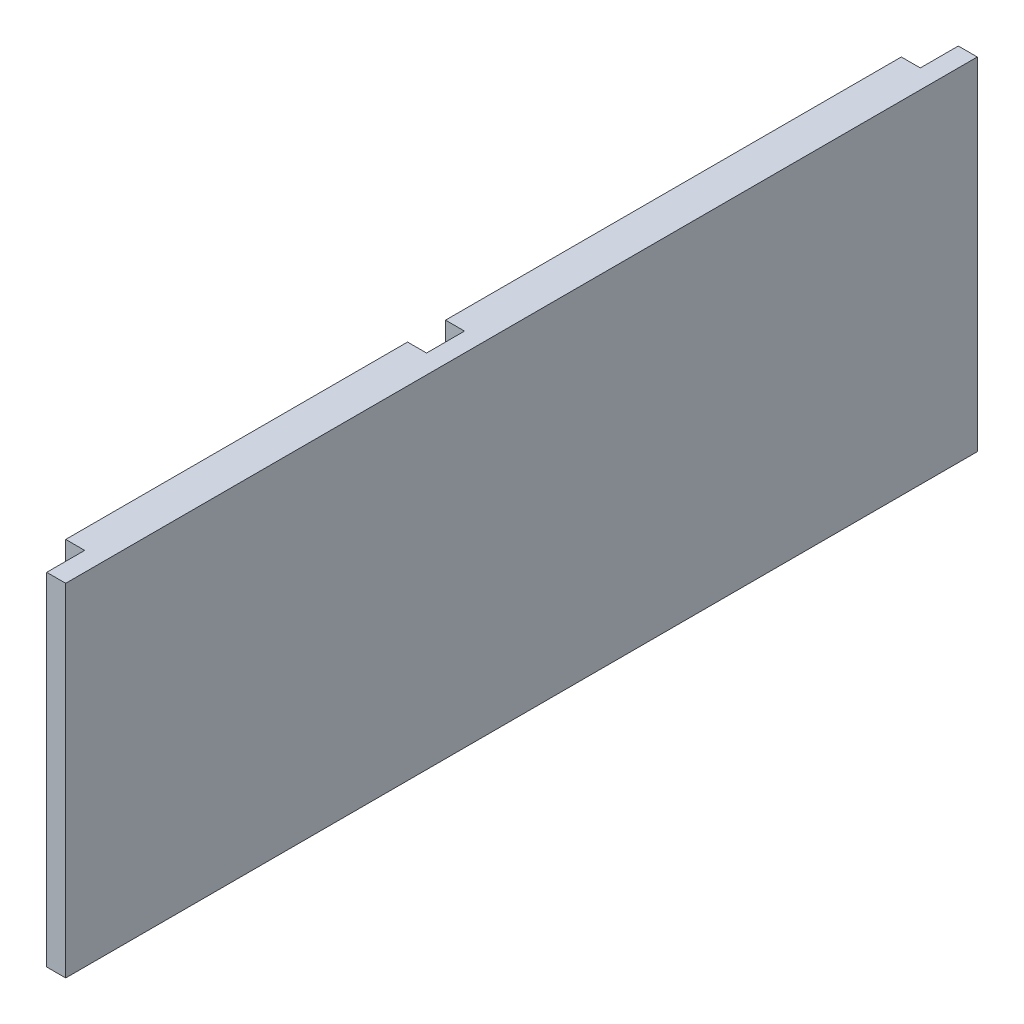
ISO-10303-21;
HEADER;
FILE_DESCRIPTION(('STEP AP214'),'2;1');
FILE_NAME('part.step','',(''),(''),'','','');
FILE_SCHEMA(('AUTOMOTIVE_DESIGN { 1 0 10303 214 1 1 1 1 }'));
ENDSEC;
DATA;
#1=APPLICATION_CONTEXT('core data for automotive mechanical design processes');
#2=APPLICATION_PROTOCOL_DEFINITION('international standard','automotive_design',2000,#1);
#3=PRODUCT_CONTEXT('',#1,'mechanical');
#4=PRODUCT('Part','Part','',(#3));
#5=PRODUCT_RELATED_PRODUCT_CATEGORY('part','',(#4));
#6=PRODUCT_DEFINITION_FORMATION('','',#4);
#7=PRODUCT_DEFINITION_CONTEXT('part definition',#1,'design');
#8=PRODUCT_DEFINITION('design','',#6,#7);
#9=PRODUCT_DEFINITION_SHAPE('','',#8);
#10=(LENGTH_UNIT() NAMED_UNIT(*) SI_UNIT(.MILLI.,.METRE.));
#11=(NAMED_UNIT(*) PLANE_ANGLE_UNIT() SI_UNIT($,.RADIAN.));
#12=(NAMED_UNIT(*) SI_UNIT($,.STERADIAN.) SOLID_ANGLE_UNIT());
#13=UNCERTAINTY_MEASURE_WITH_UNIT(LENGTH_MEASURE(1.E-05),#10,'distance_accuracy_value','');
#14=(GEOMETRIC_REPRESENTATION_CONTEXT(3) GLOBAL_UNCERTAINTY_ASSIGNED_CONTEXT((#13)) GLOBAL_UNIT_ASSIGNED_CONTEXT((#10,
#11,#12)) REPRESENTATION_CONTEXT('',''));
#15=CARTESIAN_POINT('',(0.,0.,0.));
#16=DIRECTION('',(0.,0.,1.));
#17=DIRECTION('',(1.,0.,0.));
#18=AXIS2_PLACEMENT_3D('',#15,#16,#17);
#19=CARTESIAN_POINT('',(0.,0.,0.));
#20=DIRECTION('',(-1.,0.,0.));
#21=DIRECTION('',(0.,0.,1.));
#22=AXIS2_PLACEMENT_3D('',#19,#20,#21);
#23=PLANE('',#22);
#24=DIRECTION('',(0.,-1.,0.));
#25=VECTOR('',#24,1.);
#26=CARTESIAN_POINT('',(0.,114.3,-139.7));
#27=LINE('',#26,#25);
#28=CARTESIAN_POINT('',(0.,114.3,-139.7));
#29=VERTEX_POINT('',#28);
#30=CARTESIAN_POINT('',(0.,0.,-139.7));
#31=VERTEX_POINT('',#30);
#32=EDGE_CURVE('E130',#29,#31,#27,.T.);
#33=ORIENTED_EDGE('',*,*,#32,.F.);
#34=DIRECTION('',(0.,0.,1.));
#35=VECTOR('',#34,1.);
#36=CARTESIAN_POINT('',(0.,114.3,0.));
#37=LINE('',#36,#35);
#38=CARTESIAN_POINT('',(0.,114.3,-292.1));
#39=VERTEX_POINT('',#38);
#40=EDGE_CURVE('E197',#39,#29,#37,.T.);
#41=ORIENTED_EDGE('',*,*,#40,.F.);
#42=DIRECTION('',(0.,1.,0.));
#43=VECTOR('',#42,1.);
#44=CARTESIAN_POINT('',(0.,114.3,-292.1));
#45=LINE('',#44,#43);
#46=CARTESIAN_POINT('',(0.,0.,-292.1));
#47=VERTEX_POINT('',#46);
#48=EDGE_CURVE('E154',#47,#39,#45,.T.);
#49=ORIENTED_EDGE('',*,*,#48,.F.);
#50=DIRECTION('',(0.,0.,-1.));
#51=VECTOR('',#50,1.);
#52=CARTESIAN_POINT('',(0.,0.,0.));
#53=LINE('',#52,#51);
#54=EDGE_CURVE('E58',#31,#47,#53,.T.);
#55=ORIENTED_EDGE('',*,*,#54,.F.);
#56=EDGE_LOOP('',(#33,#41,#49,#55));
#57=FACE_BOUND('',#56,.T.);
#58=ADVANCED_FACE('F35',(#57),#23,.T.);
#59=CARTESIAN_POINT('',(12.7,0.,-304.8));
#60=DIRECTION('',(0.,0.,1.));
#61=DIRECTION('',(1.,0.,0.));
#62=AXIS2_PLACEMENT_3D('',#59,#60,#61);
#63=PLANE('',#62);
#64=DIRECTION('',(0.,-1.,0.));
#65=VECTOR('',#64,1.);
#66=CARTESIAN_POINT('',(6.35,114.3,-304.8));
#67=LINE('',#66,#65);
#68=CARTESIAN_POINT('',(6.35,114.3,-304.8));
#69=VERTEX_POINT('',#68);
#70=CARTESIAN_POINT('',(6.35,0.,-304.8));
#71=VERTEX_POINT('',#70);
#72=EDGE_CURVE('E159',#69,#71,#67,.T.);
#73=ORIENTED_EDGE('',*,*,#72,.F.);
#74=DIRECTION('',(-1.,0.,0.));
#75=VECTOR('',#74,1.);
#76=CARTESIAN_POINT('',(12.7,114.3,-304.8));
#77=LINE('',#76,#75);
#78=CARTESIAN_POINT('',(12.7,114.3,-304.8));
#79=VERTEX_POINT('',#78);
#80=EDGE_CURVE('E211',#79,#69,#77,.T.);
#81=ORIENTED_EDGE('',*,*,#80,.F.);
#82=DIRECTION('',(0.,1.,0.));
#83=VECTOR('',#82,1.);
#84=CARTESIAN_POINT('',(12.7,0.,-304.8));
#85=LINE('',#84,#83);
#86=CARTESIAN_POINT('',(12.7,0.,-304.8));
#87=VERTEX_POINT('',#86);
#88=EDGE_CURVE('E199',#87,#79,#85,.T.);
#89=ORIENTED_EDGE('',*,*,#88,.F.);
#90=DIRECTION('',(-1.,0.,0.));
#91=VECTOR('',#90,1.);
#92=CARTESIAN_POINT('',(12.7,0.,-304.8));
#93=LINE('',#92,#91);
#94=EDGE_CURVE('E43',#87,#71,#93,.T.);
#95=ORIENTED_EDGE('',*,*,#94,.T.);
#96=EDGE_LOOP('',(#73,#81,#89,#95));
#97=FACE_BOUND('',#96,.T.);
#98=ADVANCED_FACE('F218',(#97),#63,.F.);
#99=CARTESIAN_POINT('',(12.7,0.,0.));
#100=DIRECTION('',(0.,0.,-1.));
#101=DIRECTION('',(-1.,0.,0.));
#102=AXIS2_PLACEMENT_3D('',#99,#100,#101);
#103=PLANE('',#102);
#104=DIRECTION('',(-1.,0.,0.));
#105=VECTOR('',#104,1.);
#106=CARTESIAN_POINT('',(12.7,114.3,0.));
#107=LINE('',#106,#105);
#108=CARTESIAN_POINT('',(12.7,114.3,0.));
#109=VERTEX_POINT('',#108);
#110=CARTESIAN_POINT('',(6.35,114.3,0.));
#111=VERTEX_POINT('',#110);
#112=EDGE_CURVE('E203',#109,#111,#107,.T.);
#113=ORIENTED_EDGE('',*,*,#112,.T.);
#114=DIRECTION('',(0.,1.,0.));
#115=VECTOR('',#114,1.);
#116=CARTESIAN_POINT('',(6.35,114.3,0.));
#117=LINE('',#116,#115);
#118=CARTESIAN_POINT('',(6.35,0.,0.));
#119=VERTEX_POINT('',#118);
#120=EDGE_CURVE('E176',#119,#111,#117,.T.);
#121=ORIENTED_EDGE('',*,*,#120,.F.);
#122=DIRECTION('',(-1.,0.,0.));
#123=VECTOR('',#122,1.);
#124=CARTESIAN_POINT('',(12.7,0.,0.));
#125=LINE('',#124,#123);
#126=CARTESIAN_POINT('',(12.7,0.,0.));
#127=VERTEX_POINT('',#126);
#128=EDGE_CURVE('E11',#127,#119,#125,.T.);
#129=ORIENTED_EDGE('',*,*,#128,.F.);
#130=DIRECTION('',(0.,-1.,0.));
#131=VECTOR('',#130,1.);
#132=CARTESIAN_POINT('',(12.7,0.,0.));
#133=LINE('',#132,#131);
#134=EDGE_CURVE('E193',#109,#127,#133,.T.);
#135=ORIENTED_EDGE('',*,*,#134,.F.);
#136=EDGE_LOOP('',(#113,#121,#129,#135));
#137=FACE_BOUND('',#136,.T.);
#138=ADVANCED_FACE('F37',(#137),#103,.F.);
#139=CARTESIAN_POINT('',(12.7,0.,0.));
#140=DIRECTION('',(0.,1.,0.));
#141=DIRECTION('',(0.,0.,1.));
#142=AXIS2_PLACEMENT_3D('',#139,#140,#141);
#143=PLANE('',#142);
#144=DIRECTION('',(0.,0.,1.));
#145=VECTOR('',#144,1.);
#146=CARTESIAN_POINT('',(6.35,0.,-139.7));
#147=LINE('',#146,#145);
#148=CARTESIAN_POINT('',(6.35,0.,-139.7));
#149=VERTEX_POINT('',#148);
#150=CARTESIAN_POINT('',(6.35,0.,-127.));
#151=VERTEX_POINT('',#150);
#152=EDGE_CURVE('E138',#149,#151,#147,.T.);
#153=ORIENTED_EDGE('',*,*,#152,.F.);
#154=DIRECTION('',(-1.,0.,0.));
#155=VECTOR('',#154,1.);
#156=CARTESIAN_POINT('',(6.35,0.,-139.7));
#157=LINE('',#156,#155);
#158=EDGE_CURVE('E124',#149,#31,#157,.T.);
#159=ORIENTED_EDGE('',*,*,#158,.T.);
#160=ORIENTED_EDGE('',*,*,#54,.T.);
#161=DIRECTION('',(-1.,0.,0.));
#162=VECTOR('',#161,1.);
#163=CARTESIAN_POINT('',(6.35,0.,-292.1));
#164=LINE('',#163,#162);
#165=CARTESIAN_POINT('',(6.35,0.,-292.1));
#166=VERTEX_POINT('',#165);
#167=EDGE_CURVE('E169',#166,#47,#164,.T.);
#168=ORIENTED_EDGE('',*,*,#167,.F.);
#169=DIRECTION('',(0.,0.,1.));
#170=VECTOR('',#169,1.);
#171=CARTESIAN_POINT('',(6.35,0.,-304.8));
#172=LINE('',#171,#170);
#173=EDGE_CURVE('E161',#71,#166,#172,.T.);
#174=ORIENTED_EDGE('',*,*,#173,.F.);
#175=ORIENTED_EDGE('',*,*,#94,.F.);
#176=DIRECTION('',(0.,0.,-1.));
#177=VECTOR('',#176,1.);
#178=CARTESIAN_POINT('',(12.7,0.,0.));
#179=LINE('',#178,#177);
#180=EDGE_CURVE('E196',#127,#87,#179,.T.);
#181=ORIENTED_EDGE('',*,*,#180,.F.);
#182=ORIENTED_EDGE('',*,*,#128,.T.);
#183=DIRECTION('',(0.,0.,1.));
#184=VECTOR('',#183,1.);
#185=CARTESIAN_POINT('',(6.35,0.,0.));
#186=LINE('',#185,#184);
#187=CARTESIAN_POINT('',(6.35,0.,-12.7));
#188=VERTEX_POINT('',#187);
#189=EDGE_CURVE('E184',#188,#119,#186,.T.);
#190=ORIENTED_EDGE('',*,*,#189,.F.);
#191=DIRECTION('',(-1.,0.,0.));
#192=VECTOR('',#191,1.);
#193=CARTESIAN_POINT('',(6.35,0.,-12.7));
#194=LINE('',#193,#192);
#195=CARTESIAN_POINT('',(0.,0.,-12.7));
#196=VERTEX_POINT('',#195);
#197=EDGE_CURVE('E188',#188,#196,#194,.T.);
#198=ORIENTED_EDGE('',*,*,#197,.T.);
#199=CARTESIAN_POINT('',(0.,0.,-127.));
#200=VERTEX_POINT('',#199);
#201=EDGE_CURVE('E204',#196,#200,#53,.T.);
#202=ORIENTED_EDGE('',*,*,#201,.T.);
#203=DIRECTION('',(-1.,0.,0.));
#204=VECTOR('',#203,1.);
#205=CARTESIAN_POINT('',(6.35,0.,-127.));
#206=LINE('',#205,#204);
#207=EDGE_CURVE('E50',#151,#200,#206,.T.);
#208=ORIENTED_EDGE('',*,*,#207,.F.);
#209=EDGE_LOOP('',(#153,#159,#160,#168,#174,#175,#181,#182,#190,#198,#202,#208));
#210=FACE_BOUND('',#209,.T.);
#211=ADVANCED_FACE('F143',(#210),#143,.F.);
#212=CARTESIAN_POINT('',(12.7,114.3,0.));
#213=DIRECTION('',(0.,-1.,0.));
#214=DIRECTION('',(0.,0.,-1.));
#215=AXIS2_PLACEMENT_3D('',#212,#213,#214);
#216=PLANE('',#215);
#217=ORIENTED_EDGE('',*,*,#40,.T.);
#218=DIRECTION('',(-1.,0.,0.));
#219=VECTOR('',#218,1.);
#220=CARTESIAN_POINT('',(6.35,114.3,-139.7));
#221=LINE('',#220,#219);
#222=CARTESIAN_POINT('',(6.35,114.3,-139.7));
#223=VERTEX_POINT('',#222);
#224=EDGE_CURVE('E152',#223,#29,#221,.T.);
#225=ORIENTED_EDGE('',*,*,#224,.F.);
#226=DIRECTION('',(0.,0.,-1.));
#227=VECTOR('',#226,1.);
#228=CARTESIAN_POINT('',(6.35,114.3,-139.7));
#229=LINE('',#228,#227);
#230=CARTESIAN_POINT('',(6.35,114.3,-127.));
#231=VERTEX_POINT('',#230);
#232=EDGE_CURVE('E132',#231,#223,#229,.T.);
#233=ORIENTED_EDGE('',*,*,#232,.F.);
#234=DIRECTION('',(-1.,0.,0.));
#235=VECTOR('',#234,1.);
#236=CARTESIAN_POINT('',(6.35,114.3,-127.));
#237=LINE('',#236,#235);
#238=CARTESIAN_POINT('',(0.,114.3,-127.));
#239=VERTEX_POINT('',#238);
#240=EDGE_CURVE('E155',#231,#239,#237,.T.);
#241=ORIENTED_EDGE('',*,*,#240,.T.);
#242=CARTESIAN_POINT('',(0.,114.3,-12.7));
#243=VERTEX_POINT('',#242);
#244=EDGE_CURVE('E206',#239,#243,#37,.T.);
#245=ORIENTED_EDGE('',*,*,#244,.T.);
#246=DIRECTION('',(-1.,0.,0.));
#247=VECTOR('',#246,1.);
#248=CARTESIAN_POINT('',(6.35,114.3,-12.7));
#249=LINE('',#248,#247);
#250=CARTESIAN_POINT('',(6.35,114.3,-12.7));
#251=VERTEX_POINT('',#250);
#252=EDGE_CURVE('E186',#251,#243,#249,.T.);
#253=ORIENTED_EDGE('',*,*,#252,.F.);
#254=DIRECTION('',(0.,0.,-1.));
#255=VECTOR('',#254,1.);
#256=CARTESIAN_POINT('',(6.35,114.3,0.));
#257=LINE('',#256,#255);
#258=EDGE_CURVE('E178',#111,#251,#257,.T.);
#259=ORIENTED_EDGE('',*,*,#258,.F.);
#260=ORIENTED_EDGE('',*,*,#112,.F.);
#261=DIRECTION('',(0.,0.,1.));
#262=VECTOR('',#261,1.);
#263=CARTESIAN_POINT('',(12.7,114.3,0.));
#264=LINE('',#263,#262);
#265=EDGE_CURVE('E201',#79,#109,#264,.T.);
#266=ORIENTED_EDGE('',*,*,#265,.F.);
#267=ORIENTED_EDGE('',*,*,#80,.T.);
#268=DIRECTION('',(0.,0.,-1.));
#269=VECTOR('',#268,1.);
#270=CARTESIAN_POINT('',(6.35,114.3,-304.8));
#271=LINE('',#270,#269);
#272=CARTESIAN_POINT('',(6.35,114.3,-292.1));
#273=VERTEX_POINT('',#272);
#274=EDGE_CURVE('E167',#273,#69,#271,.T.);
#275=ORIENTED_EDGE('',*,*,#274,.F.);
#276=DIRECTION('',(-1.,0.,0.));
#277=VECTOR('',#276,1.);
#278=CARTESIAN_POINT('',(6.35,114.3,-292.1));
#279=LINE('',#278,#277);
#280=EDGE_CURVE('E171',#273,#39,#279,.T.);
#281=ORIENTED_EDGE('',*,*,#280,.T.);
#282=EDGE_LOOP('',(#217,#225,#233,#241,#245,#253,#259,#260,#266,#267,#275,#281));
#283=FACE_BOUND('',#282,.T.);
#284=ADVANCED_FACE('F225',(#283),#216,.F.);
#285=CARTESIAN_POINT('',(12.7,0.,0.));
#286=DIRECTION('',(-1.,0.,0.));
#287=DIRECTION('',(0.,0.,1.));
#288=AXIS2_PLACEMENT_3D('',#285,#286,#287);
#289=PLANE('',#288);
#290=ORIENTED_EDGE('',*,*,#134,.T.);
#291=ORIENTED_EDGE('',*,*,#180,.T.);
#292=ORIENTED_EDGE('',*,*,#88,.T.);
#293=ORIENTED_EDGE('',*,*,#265,.T.);
#294=EDGE_LOOP('',(#290,#291,#292,#293));
#295=FACE_BOUND('',#294,.T.);
#296=ADVANCED_FACE('F232',(#295),#289,.F.);
#297=DIRECTION('',(0.,1.,0.));
#298=VECTOR('',#297,1.);
#299=CARTESIAN_POINT('',(0.,114.3,-127.));
#300=LINE('',#299,#298);
#301=EDGE_CURVE('E141',#200,#239,#300,.T.);
#302=ORIENTED_EDGE('',*,*,#301,.F.);
#303=ORIENTED_EDGE('',*,*,#201,.F.);
#304=DIRECTION('',(0.,-1.,0.));
#305=VECTOR('',#304,1.);
#306=CARTESIAN_POINT('',(0.,114.3,-12.7));
#307=LINE('',#306,#305);
#308=EDGE_CURVE('E174',#243,#196,#307,.T.);
#309=ORIENTED_EDGE('',*,*,#308,.F.);
#310=ORIENTED_EDGE('',*,*,#244,.F.);
#311=EDGE_LOOP('',(#302,#303,#309,#310));
#312=FACE_BOUND('',#311,.T.);
#313=ADVANCED_FACE('F246',(#312),#23,.T.);
#314=CARTESIAN_POINT('',(6.35,114.3,-12.7));
#315=DIRECTION('',(0.,0.,-1.));
#316=DIRECTION('',(0.,1.,0.));
#317=AXIS2_PLACEMENT_3D('',#314,#315,#316);
#318=PLANE('',#317);
#319=ORIENTED_EDGE('',*,*,#308,.T.);
#320=ORIENTED_EDGE('',*,*,#197,.F.);
#321=DIRECTION('',(0.,-1.,0.));
#322=VECTOR('',#321,1.);
#323=CARTESIAN_POINT('',(6.35,114.3,-12.7));
#324=LINE('',#323,#322);
#325=EDGE_CURVE('E181',#251,#188,#324,.T.);
#326=ORIENTED_EDGE('',*,*,#325,.F.);
#327=ORIENTED_EDGE('',*,*,#252,.T.);
#328=EDGE_LOOP('',(#319,#320,#326,#327));
#329=FACE_BOUND('',#328,.T.);
#330=ADVANCED_FACE('F242',(#329),#318,.F.);
#331=CARTESIAN_POINT('',(6.35,0.,0.));
#332=DIRECTION('',(1.,0.,0.));
#333=DIRECTION('',(0.,0.,-1.));
#334=AXIS2_PLACEMENT_3D('',#331,#332,#333);
#335=PLANE('',#334);
#336=ORIENTED_EDGE('',*,*,#120,.T.);
#337=ORIENTED_EDGE('',*,*,#258,.T.);
#338=ORIENTED_EDGE('',*,*,#325,.T.);
#339=ORIENTED_EDGE('',*,*,#189,.T.);
#340=EDGE_LOOP('',(#336,#337,#338,#339));
#341=FACE_BOUND('',#340,.T.);
#342=ADVANCED_FACE('F239',(#341),#335,.F.);
#343=CARTESIAN_POINT('',(6.35,114.3,-292.1));
#344=DIRECTION('',(0.,0.,1.));
#345=DIRECTION('',(1.,0.,0.));
#346=AXIS2_PLACEMENT_3D('',#343,#344,#345);
#347=PLANE('',#346);
#348=ORIENTED_EDGE('',*,*,#48,.T.);
#349=ORIENTED_EDGE('',*,*,#280,.F.);
#350=DIRECTION('',(0.,1.,0.));
#351=VECTOR('',#350,1.);
#352=CARTESIAN_POINT('',(6.35,114.3,-292.1));
#353=LINE('',#352,#351);
#354=EDGE_CURVE('E164',#166,#273,#353,.T.);
#355=ORIENTED_EDGE('',*,*,#354,.F.);
#356=ORIENTED_EDGE('',*,*,#167,.T.);
#357=EDGE_LOOP('',(#348,#349,#355,#356));
#358=FACE_BOUND('',#357,.T.);
#359=ADVANCED_FACE('F251',(#358),#347,.F.);
#360=CARTESIAN_POINT('',(6.35,0.,0.));
#361=DIRECTION('',(-1.,0.,0.));
#362=DIRECTION('',(0.,0.,1.));
#363=AXIS2_PLACEMENT_3D('',#360,#361,#362);
#364=PLANE('',#363);
#365=ORIENTED_EDGE('',*,*,#72,.T.);
#366=ORIENTED_EDGE('',*,*,#173,.T.);
#367=ORIENTED_EDGE('',*,*,#354,.T.);
#368=ORIENTED_EDGE('',*,*,#274,.T.);
#369=EDGE_LOOP('',(#365,#366,#367,#368));
#370=FACE_BOUND('',#369,.T.);
#371=ADVANCED_FACE('F222',(#370),#364,.T.);
#372=CARTESIAN_POINT('',(6.35,114.3,-139.7));
#373=DIRECTION('',(0.,0.,-1.));
#374=DIRECTION('',(-1.,0.,0.));
#375=AXIS2_PLACEMENT_3D('',#372,#373,#374);
#376=PLANE('',#375);
#377=ORIENTED_EDGE('',*,*,#32,.T.);
#378=ORIENTED_EDGE('',*,*,#158,.F.);
#379=DIRECTION('',(0.,-1.,0.));
#380=VECTOR('',#379,1.);
#381=CARTESIAN_POINT('',(6.35,114.3,-139.7));
#382=LINE('',#381,#380);
#383=EDGE_CURVE('E127',#223,#149,#382,.T.);
#384=ORIENTED_EDGE('',*,*,#383,.F.);
#385=ORIENTED_EDGE('',*,*,#224,.T.);
#386=EDGE_LOOP('',(#377,#378,#384,#385));
#387=FACE_BOUND('',#386,.T.);
#388=ADVANCED_FACE('F126',(#387),#376,.F.);
#389=CARTESIAN_POINT('',(6.35,114.3,-127.));
#390=DIRECTION('',(0.,0.,1.));
#391=DIRECTION('',(1.,0.,0.));
#392=AXIS2_PLACEMENT_3D('',#389,#390,#391);
#393=PLANE('',#392);
#394=ORIENTED_EDGE('',*,*,#301,.T.);
#395=ORIENTED_EDGE('',*,*,#240,.F.);
#396=DIRECTION('',(0.,1.,0.));
#397=VECTOR('',#396,1.);
#398=CARTESIAN_POINT('',(6.35,114.3,-127.));
#399=LINE('',#398,#397);
#400=EDGE_CURVE('E145',#151,#231,#399,.T.);
#401=ORIENTED_EDGE('',*,*,#400,.F.);
#402=ORIENTED_EDGE('',*,*,#207,.T.);
#403=EDGE_LOOP('',(#394,#395,#401,#402));
#404=FACE_BOUND('',#403,.T.);
#405=ADVANCED_FACE('F247',(#404),#393,.F.);
#406=CARTESIAN_POINT('',(6.35,0.,0.));
#407=DIRECTION('',(-1.,0.,0.));
#408=DIRECTION('',(0.,0.,1.));
#409=AXIS2_PLACEMENT_3D('',#406,#407,#408);
#410=PLANE('',#409);
#411=ORIENTED_EDGE('',*,*,#383,.T.);
#412=ORIENTED_EDGE('',*,*,#152,.T.);
#413=ORIENTED_EDGE('',*,*,#400,.T.);
#414=ORIENTED_EDGE('',*,*,#232,.T.);
#415=EDGE_LOOP('',(#411,#412,#413,#414));
#416=FACE_BOUND('',#415,.T.);
#417=ADVANCED_FACE('F136',(#416),#410,.T.);
#418=CLOSED_SHELL('',(#58,#98,#138,#211,#284,#296,#313,#330,#342,#359,#371,#388,#405,#417));
#419=MANIFOLD_SOLID_BREP('B2',#418);
#420=ADVANCED_BREP_SHAPE_REPRESENTATION('',(#18,#419),#14);
#421=SHAPE_DEFINITION_REPRESENTATION(#9,#420);
ENDSEC;
END-ISO-10303-21;
